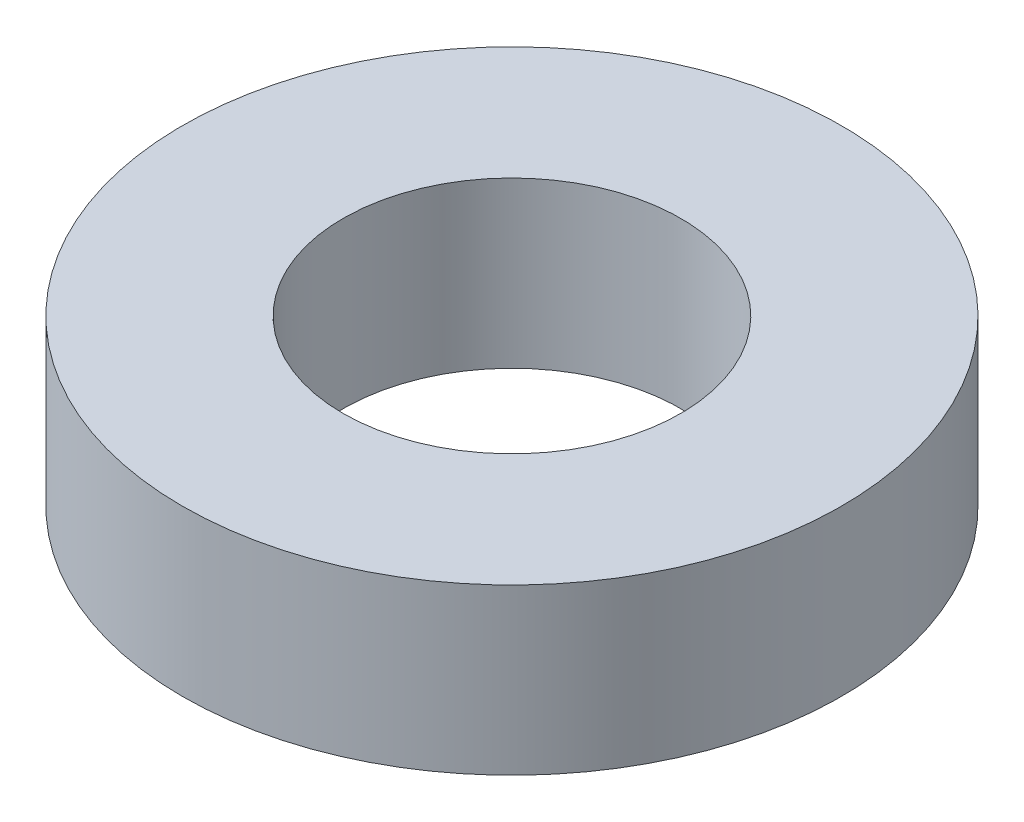
ISO-10303-21;
HEADER;
FILE_DESCRIPTION(('STEP AP214'),'2;1');
FILE_NAME('part.step','',(''),(''),'','','');
FILE_SCHEMA(('AUTOMOTIVE_DESIGN { 1 0 10303 214 1 1 1 1 }'));
ENDSEC;
DATA;
#1=APPLICATION_CONTEXT('core data for automotive mechanical design processes');
#2=APPLICATION_PROTOCOL_DEFINITION('international standard','automotive_design',2000,#1);
#3=PRODUCT_CONTEXT('',#1,'mechanical');
#4=PRODUCT('Part','Part','',(#3));
#5=PRODUCT_RELATED_PRODUCT_CATEGORY('part','',(#4));
#6=PRODUCT_DEFINITION_FORMATION('','',#4);
#7=PRODUCT_DEFINITION_CONTEXT('part definition',#1,'design');
#8=PRODUCT_DEFINITION('design','',#6,#7);
#9=PRODUCT_DEFINITION_SHAPE('','',#8);
#10=(LENGTH_UNIT() NAMED_UNIT(*) SI_UNIT(.MILLI.,.METRE.));
#11=(NAMED_UNIT(*) PLANE_ANGLE_UNIT() SI_UNIT($,.RADIAN.));
#12=(NAMED_UNIT(*) SI_UNIT($,.STERADIAN.) SOLID_ANGLE_UNIT());
#13=UNCERTAINTY_MEASURE_WITH_UNIT(LENGTH_MEASURE(1.E-05),#10,'distance_accuracy_value','');
#14=(GEOMETRIC_REPRESENTATION_CONTEXT(3) GLOBAL_UNCERTAINTY_ASSIGNED_CONTEXT((#13)) GLOBAL_UNIT_ASSIGNED_CONTEXT((#10,
#11,#12)) REPRESENTATION_CONTEXT('',''));
#15=CARTESIAN_POINT('',(0.,0.,0.));
#16=DIRECTION('',(0.,0.,1.));
#17=DIRECTION('',(1.,0.,0.));
#18=AXIS2_PLACEMENT_3D('',#15,#16,#17);
#19=CARTESIAN_POINT('',(0.,4.,0.));
#20=DIRECTION('',(0.,1.,0.));
#21=DIRECTION('',(0.,0.,1.));
#22=AXIS2_PLACEMENT_3D('',#19,#20,#21);
#23=PLANE('',#22);
#24=CARTESIAN_POINT('',(0.,4.,0.));
#25=DIRECTION('',(0.,1.,0.));
#26=DIRECTION('',(0.,0.,1.));
#27=AXIS2_PLACEMENT_3D('',#24,#25,#26);
#28=CIRCLE('',#27,8.);
#29=CARTESIAN_POINT('',(0.,4.,8.));
#30=VERTEX_POINT('',#29);
#31=EDGE_CURVE('E10',#30,#30,#28,.T.);
#32=ORIENTED_EDGE('',*,*,#31,.T.);
#33=EDGE_LOOP('',(#32));
#34=FACE_BOUND('',#33,.T.);
#35=CARTESIAN_POINT('',(0.,4.,0.));
#36=DIRECTION('',(0.,1.,0.));
#37=DIRECTION('',(0.,0.,1.));
#38=AXIS2_PLACEMENT_3D('',#35,#36,#37);
#39=CIRCLE('',#38,4.1);
#40=CARTESIAN_POINT('',(0.,4.,4.1));
#41=VERTEX_POINT('',#40);
#42=EDGE_CURVE('E44',#41,#41,#39,.T.);
#43=ORIENTED_EDGE('',*,*,#42,.F.);
#44=EDGE_LOOP('',(#43));
#45=FACE_BOUND('',#44,.T.);
#46=ADVANCED_FACE('F33',(#34,#45),#23,.T.);
#47=CARTESIAN_POINT('',(0.,0.,0.));
#48=DIRECTION('',(0.,1.,0.));
#49=DIRECTION('',(0.,0.,1.));
#50=AXIS2_PLACEMENT_3D('',#47,#48,#49);
#51=PLANE('',#50);
#52=CARTESIAN_POINT('',(0.,0.,0.));
#53=DIRECTION('',(0.,1.,0.));
#54=DIRECTION('',(0.,0.,1.));
#55=AXIS2_PLACEMENT_3D('',#52,#53,#54);
#56=CIRCLE('',#55,8.);
#57=CARTESIAN_POINT('',(0.,0.,8.));
#58=VERTEX_POINT('',#57);
#59=EDGE_CURVE('E37',#58,#58,#56,.T.);
#60=ORIENTED_EDGE('',*,*,#59,.F.);
#61=EDGE_LOOP('',(#60));
#62=FACE_BOUND('',#61,.T.);
#63=CARTESIAN_POINT('',(0.,0.,0.));
#64=DIRECTION('',(0.,1.,0.));
#65=DIRECTION('',(0.,0.,1.));
#66=AXIS2_PLACEMENT_3D('',#63,#64,#65);
#67=CIRCLE('',#66,4.1);
#68=CARTESIAN_POINT('',(0.,0.,4.1));
#69=VERTEX_POINT('',#68);
#70=EDGE_CURVE('E46',#69,#69,#67,.T.);
#71=ORIENTED_EDGE('',*,*,#70,.T.);
#72=EDGE_LOOP('',(#71));
#73=FACE_BOUND('',#72,.T.);
#74=ADVANCED_FACE('F56',(#62,#73),#51,.F.);
#75=CARTESIAN_POINT('',(0.,4.,0.));
#76=DIRECTION('',(0.,-1.,0.));
#77=DIRECTION('',(0.,0.,-1.));
#78=AXIS2_PLACEMENT_3D('',#75,#76,#77);
#79=CYLINDRICAL_SURFACE('',#78,8.);
#80=ORIENTED_EDGE('',*,*,#31,.F.);
#81=EDGE_LOOP('',(#80));
#82=FACE_BOUND('',#81,.T.);
#83=ORIENTED_EDGE('',*,*,#59,.T.);
#84=EDGE_LOOP('',(#83));
#85=FACE_BOUND('',#84,.T.);
#86=ADVANCED_FACE('F35',(#82,#85),#79,.T.);
#87=CARTESIAN_POINT('',(0.,4.,0.));
#88=DIRECTION('',(0.,-1.,0.));
#89=DIRECTION('',(0.,0.,-1.));
#90=AXIS2_PLACEMENT_3D('',#87,#88,#89);
#91=CYLINDRICAL_SURFACE('',#90,4.1);
#92=ORIENTED_EDGE('',*,*,#42,.T.);
#93=EDGE_LOOP('',(#92));
#94=FACE_BOUND('',#93,.T.);
#95=ORIENTED_EDGE('',*,*,#70,.F.);
#96=EDGE_LOOP('',(#95));
#97=FACE_BOUND('',#96,.T.);
#98=ADVANCED_FACE('F52',(#94,#97),#91,.F.);
#99=CLOSED_SHELL('',(#46,#74,#86,#98));
#100=MANIFOLD_SOLID_BREP('B2',#99);
#101=ADVANCED_BREP_SHAPE_REPRESENTATION('',(#18,#100),#14);
#102=SHAPE_DEFINITION_REPRESENTATION(#9,#101);
ENDSEC;
END-ISO-10303-21;
